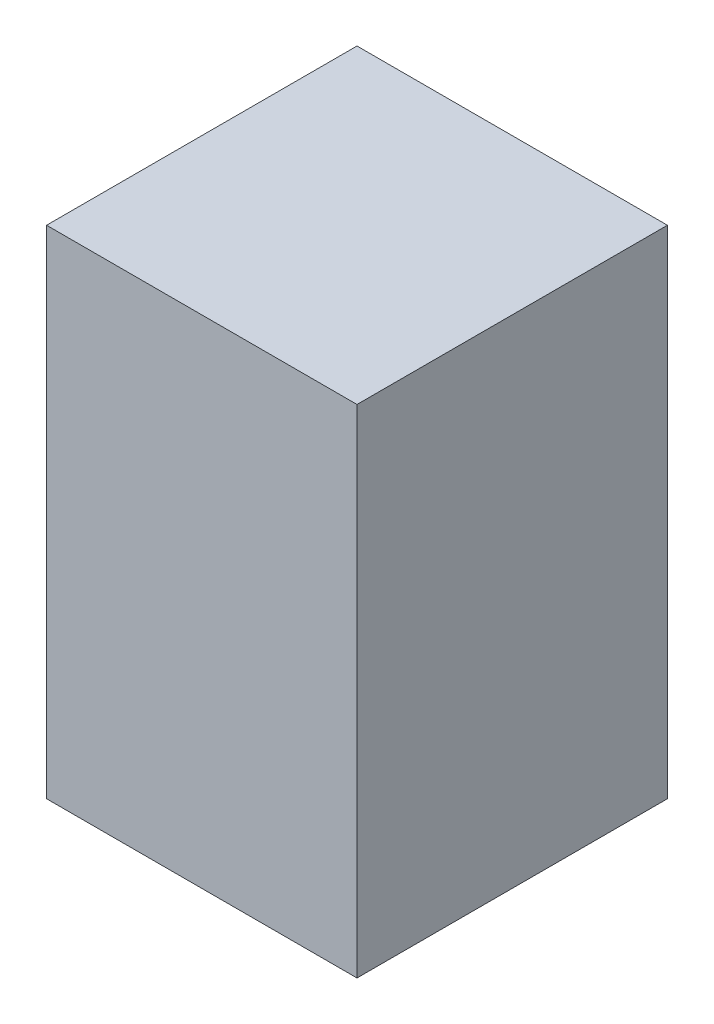
ISO-10303-21;
HEADER;
FILE_DESCRIPTION(('STEP AP214'),'2;1');
FILE_NAME('part.step','',(''),(''),'','','');
FILE_SCHEMA(('AUTOMOTIVE_DESIGN { 1 0 10303 214 1 1 1 1 }'));
ENDSEC;
DATA;
#1=APPLICATION_CONTEXT('core data for automotive mechanical design processes');
#2=APPLICATION_PROTOCOL_DEFINITION('international standard','automotive_design',2000,#1);
#3=PRODUCT_CONTEXT('',#1,'mechanical');
#4=PRODUCT('Part','Part','',(#3));
#5=PRODUCT_RELATED_PRODUCT_CATEGORY('part','',(#4));
#6=PRODUCT_DEFINITION_FORMATION('','',#4);
#7=PRODUCT_DEFINITION_CONTEXT('part definition',#1,'design');
#8=PRODUCT_DEFINITION('design','',#6,#7);
#9=PRODUCT_DEFINITION_SHAPE('','',#8);
#10=(LENGTH_UNIT() NAMED_UNIT(*) SI_UNIT(.MILLI.,.METRE.));
#11=(NAMED_UNIT(*) PLANE_ANGLE_UNIT() SI_UNIT($,.RADIAN.));
#12=(NAMED_UNIT(*) SI_UNIT($,.STERADIAN.) SOLID_ANGLE_UNIT());
#13=UNCERTAINTY_MEASURE_WITH_UNIT(LENGTH_MEASURE(1.E-05),#10,'distance_accuracy_value','');
#14=(GEOMETRIC_REPRESENTATION_CONTEXT(3) GLOBAL_UNCERTAINTY_ASSIGNED_CONTEXT((#13)) GLOBAL_UNIT_ASSIGNED_CONTEXT((#10,
#11,#12)) REPRESENTATION_CONTEXT('',''));
#15=CARTESIAN_POINT('',(0.,0.,0.));
#16=DIRECTION('',(0.,0.,1.));
#17=DIRECTION('',(1.,0.,0.));
#18=AXIS2_PLACEMENT_3D('',#15,#16,#17);
#19=CARTESIAN_POINT('',(-195.035714285714,609.6,-176.892857142857));
#20=DIRECTION('',(1.,0.,0.));
#21=DIRECTION('',(0.,0.,-1.));
#22=AXIS2_PLACEMENT_3D('',#19,#20,#21);
#23=PLANE('',#22);
#24=DIRECTION('',(0.,0.,1.));
#25=VECTOR('',#24,1.);
#26=CARTESIAN_POINT('',(-195.035714285714,0.,-176.892857142857));
#27=LINE('',#26,#25);
#28=CARTESIAN_POINT('',(-195.035714285714,0.,-176.892857142857));
#29=VERTEX_POINT('',#28);
#30=CARTESIAN_POINT('',(-195.035714285714,0.,204.107142857143));
#31=VERTEX_POINT('',#30);
#32=EDGE_CURVE('E111',#29,#31,#27,.T.);
#33=ORIENTED_EDGE('',*,*,#32,.T.);
#34=DIRECTION('',(0.,-1.,0.));
#35=VECTOR('',#34,1.);
#36=CARTESIAN_POINT('',(-195.035714285714,609.6,204.107142857143));
#37=LINE('',#36,#35);
#38=CARTESIAN_POINT('',(-195.035714285714,609.6,204.107142857143));
#39=VERTEX_POINT('',#38);
#40=EDGE_CURVE('E11',#39,#31,#37,.T.);
#41=ORIENTED_EDGE('',*,*,#40,.F.);
#42=DIRECTION('',(0.,0.,1.));
#43=VECTOR('',#42,1.);
#44=CARTESIAN_POINT('',(-195.035714285714,609.6,-176.892857142857));
#45=LINE('',#44,#43);
#46=CARTESIAN_POINT('',(-195.035714285714,609.6,-176.892857142857));
#47=VERTEX_POINT('',#46);
#48=EDGE_CURVE('E95',#47,#39,#45,.T.);
#49=ORIENTED_EDGE('',*,*,#48,.F.);
#50=DIRECTION('',(0.,-1.,0.));
#51=VECTOR('',#50,1.);
#52=CARTESIAN_POINT('',(-195.035714285714,609.6,-176.892857142857));
#53=LINE('',#52,#51);
#54=EDGE_CURVE('E107',#47,#29,#53,.T.);
#55=ORIENTED_EDGE('',*,*,#54,.T.);
#56=EDGE_LOOP('',(#33,#41,#49,#55));
#57=FACE_BOUND('',#56,.T.);
#58=ADVANCED_FACE('F43',(#57),#23,.F.);
#59=CARTESIAN_POINT('',(-195.035714285714,609.6,204.107142857143));
#60=DIRECTION('',(0.,0.,-1.));
#61=DIRECTION('',(-1.,0.,0.));
#62=AXIS2_PLACEMENT_3D('',#59,#60,#61);
#63=PLANE('',#62);
#64=DIRECTION('',(1.,0.,0.));
#65=VECTOR('',#64,1.);
#66=CARTESIAN_POINT('',(-195.035714285714,0.,204.107142857143));
#67=LINE('',#66,#65);
#68=CARTESIAN_POINT('',(185.964285714286,0.,204.107142857143));
#69=VERTEX_POINT('',#68);
#70=EDGE_CURVE('E100',#31,#69,#67,.T.);
#71=ORIENTED_EDGE('',*,*,#70,.T.);
#72=DIRECTION('',(0.,-1.,0.));
#73=VECTOR('',#72,1.);
#74=CARTESIAN_POINT('',(185.964285714286,609.6,204.107142857143));
#75=LINE('',#74,#73);
#76=CARTESIAN_POINT('',(185.964285714286,609.6,204.107142857143));
#77=VERTEX_POINT('',#76);
#78=EDGE_CURVE('E52',#77,#69,#75,.T.);
#79=ORIENTED_EDGE('',*,*,#78,.F.);
#80=DIRECTION('',(1.,0.,0.));
#81=VECTOR('',#80,1.);
#82=CARTESIAN_POINT('',(-195.035714285714,609.6,204.107142857143));
#83=LINE('',#82,#81);
#84=EDGE_CURVE('E90',#39,#77,#83,.T.);
#85=ORIENTED_EDGE('',*,*,#84,.F.);
#86=ORIENTED_EDGE('',*,*,#40,.T.);
#87=EDGE_LOOP('',(#71,#79,#85,#86));
#88=FACE_BOUND('',#87,.T.);
#89=ADVANCED_FACE('F99',(#88),#63,.F.);
#90=CARTESIAN_POINT('',(185.964285714286,609.6,-176.892857142857));
#91=DIRECTION('',(-1.,0.,0.));
#92=DIRECTION('',(0.,0.,1.));
#93=AXIS2_PLACEMENT_3D('',#90,#91,#92);
#94=PLANE('',#93);
#95=DIRECTION('',(0.,0.,-1.));
#96=VECTOR('',#95,1.);
#97=CARTESIAN_POINT('',(185.964285714286,0.,-176.892857142857));
#98=LINE('',#97,#96);
#99=CARTESIAN_POINT('',(185.964285714286,0.,-176.892857142857));
#100=VERTEX_POINT('',#99);
#101=EDGE_CURVE('E77',#69,#100,#98,.T.);
#102=ORIENTED_EDGE('',*,*,#101,.T.);
#103=DIRECTION('',(0.,-1.,0.));
#104=VECTOR('',#103,1.);
#105=CARTESIAN_POINT('',(185.964285714286,609.6,-176.892857142857));
#106=LINE('',#105,#104);
#107=CARTESIAN_POINT('',(185.964285714286,609.6,-176.892857142857));
#108=VERTEX_POINT('',#107);
#109=EDGE_CURVE('E102',#108,#100,#106,.T.);
#110=ORIENTED_EDGE('',*,*,#109,.F.);
#111=DIRECTION('',(0.,0.,-1.));
#112=VECTOR('',#111,1.);
#113=CARTESIAN_POINT('',(185.964285714286,609.6,-176.892857142857));
#114=LINE('',#113,#112);
#115=EDGE_CURVE('E93',#77,#108,#114,.T.);
#116=ORIENTED_EDGE('',*,*,#115,.F.);
#117=ORIENTED_EDGE('',*,*,#78,.T.);
#118=EDGE_LOOP('',(#102,#110,#116,#117));
#119=FACE_BOUND('',#118,.T.);
#120=ADVANCED_FACE('F103',(#119),#94,.F.);
#121=CARTESIAN_POINT('',(-195.035714285714,609.6,-176.892857142857));
#122=DIRECTION('',(0.,0.,1.));
#123=DIRECTION('',(1.,0.,0.));
#124=AXIS2_PLACEMENT_3D('',#121,#122,#123);
#125=PLANE('',#124);
#126=DIRECTION('',(-1.,0.,0.));
#127=VECTOR('',#126,1.);
#128=CARTESIAN_POINT('',(-195.035714285714,0.,-176.892857142857));
#129=LINE('',#128,#127);
#130=EDGE_CURVE('E83',#100,#29,#129,.T.);
#131=ORIENTED_EDGE('',*,*,#130,.T.);
#132=ORIENTED_EDGE('',*,*,#54,.F.);
#133=DIRECTION('',(-1.,0.,0.));
#134=VECTOR('',#133,1.);
#135=CARTESIAN_POINT('',(-195.035714285714,609.6,-176.892857142857));
#136=LINE('',#135,#134);
#137=EDGE_CURVE('E60',#108,#47,#136,.T.);
#138=ORIENTED_EDGE('',*,*,#137,.F.);
#139=ORIENTED_EDGE('',*,*,#109,.T.);
#140=EDGE_LOOP('',(#131,#132,#138,#139));
#141=FACE_BOUND('',#140,.T.);
#142=ADVANCED_FACE('F124',(#141),#125,.F.);
#143=CARTESIAN_POINT('',(0.,609.6,0.));
#144=DIRECTION('',(0.,1.,0.));
#145=DIRECTION('',(0.,0.,1.));
#146=AXIS2_PLACEMENT_3D('',#143,#144,#145);
#147=PLANE('',#146);
#148=ORIENTED_EDGE('',*,*,#48,.T.);
#149=ORIENTED_EDGE('',*,*,#84,.T.);
#150=ORIENTED_EDGE('',*,*,#115,.T.);
#151=ORIENTED_EDGE('',*,*,#137,.T.);
#152=EDGE_LOOP('',(#148,#149,#150,#151));
#153=FACE_BOUND('',#152,.T.);
#154=ADVANCED_FACE('F91',(#153),#147,.T.);
#155=CARTESIAN_POINT('',(0.,0.,0.));
#156=DIRECTION('',(0.,1.,0.));
#157=DIRECTION('',(0.,0.,1.));
#158=AXIS2_PLACEMENT_3D('',#155,#156,#157);
#159=PLANE('',#158);
#160=ORIENTED_EDGE('',*,*,#32,.F.);
#161=ORIENTED_EDGE('',*,*,#130,.F.);
#162=ORIENTED_EDGE('',*,*,#101,.F.);
#163=ORIENTED_EDGE('',*,*,#70,.F.);
#164=EDGE_LOOP('',(#160,#161,#162,#163));
#165=FACE_BOUND('',#164,.T.);
#166=ADVANCED_FACE('F127',(#165),#159,.F.);
#167=CLOSED_SHELL('',(#58,#89,#120,#142,#154,#166));
#168=MANIFOLD_SOLID_BREP('B2',#167);
#169=ADVANCED_BREP_SHAPE_REPRESENTATION('',(#18,#168),#14);
#170=SHAPE_DEFINITION_REPRESENTATION(#9,#169);
ENDSEC;
END-ISO-10303-21;
